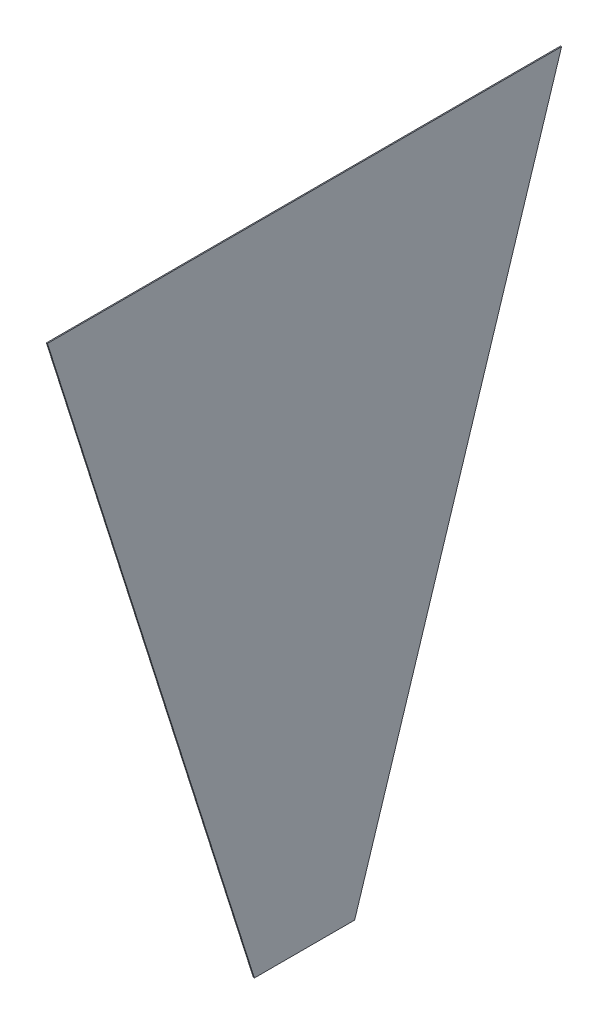
ISO-10303-21;
HEADER;
FILE_DESCRIPTION(('STEP AP214'),'2;1');
FILE_NAME('part.step','',(''),(''),'','','');
FILE_SCHEMA(('AUTOMOTIVE_DESIGN { 1 0 10303 214 1 1 1 1 }'));
ENDSEC;
DATA;
#1=APPLICATION_CONTEXT('core data for automotive mechanical design processes');
#2=APPLICATION_PROTOCOL_DEFINITION('international standard','automotive_design',2000,#1);
#3=PRODUCT_CONTEXT('',#1,'mechanical');
#4=PRODUCT('Part','Part','',(#3));
#5=PRODUCT_RELATED_PRODUCT_CATEGORY('part','',(#4));
#6=PRODUCT_DEFINITION_FORMATION('','',#4);
#7=PRODUCT_DEFINITION_CONTEXT('part definition',#1,'design');
#8=PRODUCT_DEFINITION('design','',#6,#7);
#9=PRODUCT_DEFINITION_SHAPE('','',#8);
#10=(LENGTH_UNIT() NAMED_UNIT(*) SI_UNIT(.MILLI.,.METRE.));
#11=(NAMED_UNIT(*) PLANE_ANGLE_UNIT() SI_UNIT($,.RADIAN.));
#12=(NAMED_UNIT(*) SI_UNIT($,.STERADIAN.) SOLID_ANGLE_UNIT());
#13=UNCERTAINTY_MEASURE_WITH_UNIT(LENGTH_MEASURE(1.E-05),#10,'distance_accuracy_value','');
#14=(GEOMETRIC_REPRESENTATION_CONTEXT(3) GLOBAL_UNCERTAINTY_ASSIGNED_CONTEXT((#13)) GLOBAL_UNIT_ASSIGNED_CONTEXT((#10,
#11,#12)) REPRESENTATION_CONTEXT('',''));
#15=CARTESIAN_POINT('',(0.,0.,0.));
#16=DIRECTION('',(0.,0.,1.));
#17=DIRECTION('',(1.,0.,0.));
#18=AXIS2_PLACEMENT_3D('',#15,#16,#17);
#19=CARTESIAN_POINT('',(1.22,381.,300.));
#20=DIRECTION('',(0.,0.302119095181507,-0.953270188523016));
#21=DIRECTION('',(0.,0.953270188523016,0.302119095181507));
#22=AXIS2_PLACEMENT_3D('',#19,#20,#21);
#23=PLANE('',#22);
#24=DIRECTION('',(0.,-0.953270188523016,-0.302119095181507));
#25=VECTOR('',#24,1.);
#26=CARTESIAN_POINT('',(0.,381.,300.));
#27=LINE('',#26,#25);
#28=CARTESIAN_POINT('',(0.,381.,300.));
#29=VERTEX_POINT('',#28);
#30=CARTESIAN_POINT('',(0.,-381.,58.5));
#31=VERTEX_POINT('',#30);
#32=EDGE_CURVE('E107',#29,#31,#27,.T.);
#33=ORIENTED_EDGE('',*,*,#32,.T.);
#34=DIRECTION('',(-1.,0.,0.));
#35=VECTOR('',#34,1.);
#36=CARTESIAN_POINT('',(1.22,-381.,58.5));
#37=LINE('',#36,#35);
#38=CARTESIAN_POINT('',(1.22,-381.,58.5));
#39=VERTEX_POINT('',#38);
#40=EDGE_CURVE('E11',#39,#31,#37,.T.);
#41=ORIENTED_EDGE('',*,*,#40,.F.);
#42=DIRECTION('',(0.,-0.953270188523016,-0.302119095181507));
#43=VECTOR('',#42,1.);
#44=CARTESIAN_POINT('',(1.22,381.,300.));
#45=LINE('',#44,#43);
#46=CARTESIAN_POINT('',(1.22,381.,300.));
#47=VERTEX_POINT('',#46);
#48=EDGE_CURVE('E91',#47,#39,#45,.T.);
#49=ORIENTED_EDGE('',*,*,#48,.F.);
#50=DIRECTION('',(-1.,0.,0.));
#51=VECTOR('',#50,1.);
#52=CARTESIAN_POINT('',(1.22,381.,300.));
#53=LINE('',#52,#51);
#54=EDGE_CURVE('E103',#47,#29,#53,.T.);
#55=ORIENTED_EDGE('',*,*,#54,.T.);
#56=EDGE_LOOP('',(#33,#41,#49,#55));
#57=FACE_BOUND('',#56,.T.);
#58=ADVANCED_FACE('F39',(#57),#23,.F.);
#59=CARTESIAN_POINT('',(1.22,-381.,0.));
#60=DIRECTION('',(0.,1.,0.));
#61=DIRECTION('',(0.,0.,1.));
#62=AXIS2_PLACEMENT_3D('',#59,#60,#61);
#63=PLANE('',#62);
#64=DIRECTION('',(0.,0.,-1.));
#65=VECTOR('',#64,1.);
#66=CARTESIAN_POINT('',(0.,-381.,0.));
#67=LINE('',#66,#65);
#68=CARTESIAN_POINT('',(0.,-381.,-58.5));
#69=VERTEX_POINT('',#68);
#70=EDGE_CURVE('E96',#31,#69,#67,.T.);
#71=ORIENTED_EDGE('',*,*,#70,.T.);
#72=DIRECTION('',(-1.,0.,0.));
#73=VECTOR('',#72,1.);
#74=CARTESIAN_POINT('',(1.22,-381.,-58.5));
#75=LINE('',#74,#73);
#76=CARTESIAN_POINT('',(1.22,-381.,-58.5));
#77=VERTEX_POINT('',#76);
#78=EDGE_CURVE('E48',#77,#69,#75,.T.);
#79=ORIENTED_EDGE('',*,*,#78,.F.);
#80=DIRECTION('',(0.,0.,-1.));
#81=VECTOR('',#80,1.);
#82=CARTESIAN_POINT('',(1.22,-381.,0.));
#83=LINE('',#82,#81);
#84=EDGE_CURVE('E86',#39,#77,#83,.T.);
#85=ORIENTED_EDGE('',*,*,#84,.F.);
#86=ORIENTED_EDGE('',*,*,#40,.T.);
#87=EDGE_LOOP('',(#71,#79,#85,#86));
#88=FACE_BOUND('',#87,.T.);
#89=ADVANCED_FACE('F95',(#88),#63,.F.);
#90=CARTESIAN_POINT('',(1.22,381.,-300.));
#91=DIRECTION('',(0.,0.302119095181507,0.953270188523016));
#92=DIRECTION('',(0.,-0.953270188523016,0.302119095181507));
#93=AXIS2_PLACEMENT_3D('',#90,#91,#92);
#94=PLANE('',#93);
#95=DIRECTION('',(0.,0.953270188523016,-0.302119095181507));
#96=VECTOR('',#95,1.);
#97=CARTESIAN_POINT('',(0.,381.,-300.));
#98=LINE('',#97,#96);
#99=CARTESIAN_POINT('',(0.,381.,-300.));
#100=VERTEX_POINT('',#99);
#101=EDGE_CURVE('E73',#69,#100,#98,.T.);
#102=ORIENTED_EDGE('',*,*,#101,.T.);
#103=DIRECTION('',(-1.,0.,0.));
#104=VECTOR('',#103,1.);
#105=CARTESIAN_POINT('',(1.22,381.,-300.));
#106=LINE('',#105,#104);
#107=CARTESIAN_POINT('',(1.22,381.,-300.));
#108=VERTEX_POINT('',#107);
#109=EDGE_CURVE('E98',#108,#100,#106,.T.);
#110=ORIENTED_EDGE('',*,*,#109,.F.);
#111=DIRECTION('',(0.,0.953270188523016,-0.302119095181507));
#112=VECTOR('',#111,1.);
#113=CARTESIAN_POINT('',(1.22,381.,-300.));
#114=LINE('',#113,#112);
#115=EDGE_CURVE('E89',#77,#108,#114,.T.);
#116=ORIENTED_EDGE('',*,*,#115,.F.);
#117=ORIENTED_EDGE('',*,*,#78,.T.);
#118=EDGE_LOOP('',(#102,#110,#116,#117));
#119=FACE_BOUND('',#118,.T.);
#120=ADVANCED_FACE('F99',(#119),#94,.F.);
#121=CARTESIAN_POINT('',(1.22,381.,300.));
#122=DIRECTION('',(0.,-1.,0.));
#123=DIRECTION('',(0.,0.,-1.));
#124=AXIS2_PLACEMENT_3D('',#121,#122,#123);
#125=PLANE('',#124);
#126=DIRECTION('',(0.,0.,1.));
#127=VECTOR('',#126,1.);
#128=CARTESIAN_POINT('',(0.,381.,300.));
#129=LINE('',#128,#127);
#130=EDGE_CURVE('E79',#100,#29,#129,.T.);
#131=ORIENTED_EDGE('',*,*,#130,.T.);
#132=ORIENTED_EDGE('',*,*,#54,.F.);
#133=DIRECTION('',(0.,0.,1.));
#134=VECTOR('',#133,1.);
#135=CARTESIAN_POINT('',(1.22,381.,300.));
#136=LINE('',#135,#134);
#137=EDGE_CURVE('E56',#108,#47,#136,.T.);
#138=ORIENTED_EDGE('',*,*,#137,.F.);
#139=ORIENTED_EDGE('',*,*,#109,.T.);
#140=EDGE_LOOP('',(#131,#132,#138,#139));
#141=FACE_BOUND('',#140,.T.);
#142=ADVANCED_FACE('F120',(#141),#125,.F.);
#143=CARTESIAN_POINT('',(1.22,0.,0.));
#144=DIRECTION('',(-1.,0.,0.));
#145=DIRECTION('',(0.,0.,1.));
#146=AXIS2_PLACEMENT_3D('',#143,#144,#145);
#147=PLANE('',#146);
#148=ORIENTED_EDGE('',*,*,#48,.T.);
#149=ORIENTED_EDGE('',*,*,#84,.T.);
#150=ORIENTED_EDGE('',*,*,#115,.T.);
#151=ORIENTED_EDGE('',*,*,#137,.T.);
#152=EDGE_LOOP('',(#148,#149,#150,#151));
#153=FACE_BOUND('',#152,.T.);
#154=ADVANCED_FACE('F87',(#153),#147,.F.);
#155=CARTESIAN_POINT('',(0.,0.,0.));
#156=DIRECTION('',(-1.,0.,0.));
#157=DIRECTION('',(0.,0.,1.));
#158=AXIS2_PLACEMENT_3D('',#155,#156,#157);
#159=PLANE('',#158);
#160=ORIENTED_EDGE('',*,*,#32,.F.);
#161=ORIENTED_EDGE('',*,*,#130,.F.);
#162=ORIENTED_EDGE('',*,*,#101,.F.);
#163=ORIENTED_EDGE('',*,*,#70,.F.);
#164=EDGE_LOOP('',(#160,#161,#162,#163));
#165=FACE_BOUND('',#164,.T.);
#166=ADVANCED_FACE('F123',(#165),#159,.T.);
#167=CLOSED_SHELL('',(#58,#89,#120,#142,#154,#166));
#168=MANIFOLD_SOLID_BREP('B2',#167);
#169=ADVANCED_BREP_SHAPE_REPRESENTATION('',(#18,#168),#14);
#170=SHAPE_DEFINITION_REPRESENTATION(#9,#169);
ENDSEC;
END-ISO-10303-21;
